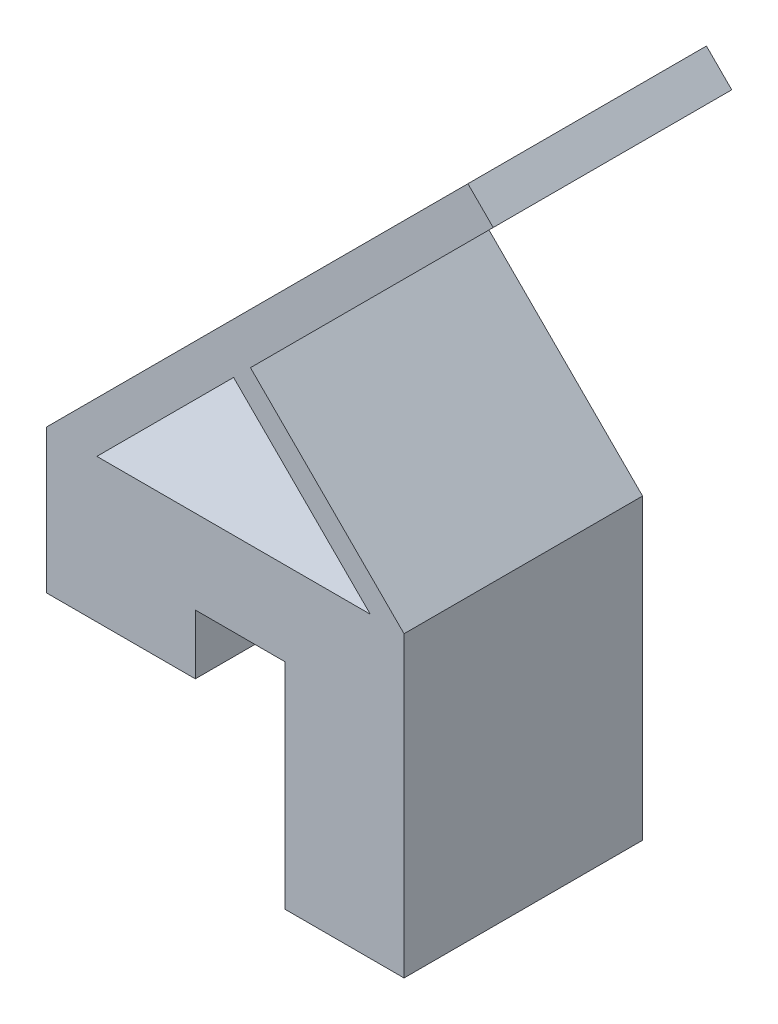
ISO-10303-21;
HEADER;
FILE_DESCRIPTION(('STEP AP214'),'2;1');
FILE_NAME('part.step','',(''),(''),'','','');
FILE_SCHEMA(('AUTOMOTIVE_DESIGN { 1 0 10303 214 1 1 1 1 }'));
ENDSEC;
DATA;
#1=APPLICATION_CONTEXT('core data for automotive mechanical design processes');
#2=APPLICATION_PROTOCOL_DEFINITION('international standard','automotive_design',2000,#1);
#3=PRODUCT_CONTEXT('',#1,'mechanical');
#4=PRODUCT('Part','Part','',(#3));
#5=PRODUCT_RELATED_PRODUCT_CATEGORY('part','',(#4));
#6=PRODUCT_DEFINITION_FORMATION('','',#4);
#7=PRODUCT_DEFINITION_CONTEXT('part definition',#1,'design');
#8=PRODUCT_DEFINITION('design','',#6,#7);
#9=PRODUCT_DEFINITION_SHAPE('','',#8);
#10=(LENGTH_UNIT() NAMED_UNIT(*) SI_UNIT(.MILLI.,.METRE.));
#11=(NAMED_UNIT(*) PLANE_ANGLE_UNIT() SI_UNIT($,.RADIAN.));
#12=(NAMED_UNIT(*) SI_UNIT($,.STERADIAN.) SOLID_ANGLE_UNIT());
#13=UNCERTAINTY_MEASURE_WITH_UNIT(LENGTH_MEASURE(1.E-05),#10,'distance_accuracy_value','');
#14=(GEOMETRIC_REPRESENTATION_CONTEXT(3) GLOBAL_UNCERTAINTY_ASSIGNED_CONTEXT((#13)) GLOBAL_UNIT_ASSIGNED_CONTEXT((#10,
#11,#12)) REPRESENTATION_CONTEXT('',''));
#15=CARTESIAN_POINT('',(0.,0.,0.));
#16=DIRECTION('',(0.,0.,1.));
#17=DIRECTION('',(1.,0.,0.));
#18=AXIS2_PLACEMENT_3D('',#15,#16,#17);
#19=CARTESIAN_POINT('',(0.,3.51351351351352,20.));
#20=DIRECTION('',(0.,-1.,0.));
#21=DIRECTION('',(1.,0.,0.));
#22=AXIS2_PLACEMENT_3D('',#19,#20,#21);
#23=PLANE('',#22);
#24=DIRECTION('',(-1.,0.,0.));
#25=VECTOR('',#24,1.);
#26=CARTESIAN_POINT('',(0.,3.51351351351352,0.));
#27=LINE('',#26,#25);
#28=CARTESIAN_POINT('',(-2.27477477477477,3.51351351351352,0.));
#29=VERTEX_POINT('',#28);
#30=CARTESIAN_POINT('',(-14.7747747747748,3.51351351351351,0.));
#31=VERTEX_POINT('',#30);
#32=EDGE_CURVE('E136',#29,#31,#27,.T.);
#33=ORIENTED_EDGE('',*,*,#32,.F.);
#34=DIRECTION('',(0.,0.,-1.));
#35=VECTOR('',#34,1.);
#36=CARTESIAN_POINT('',(-2.27477477477477,3.51351351351352,20.));
#37=LINE('',#36,#35);
#38=CARTESIAN_POINT('',(-2.27477477477477,3.51351351351352,20.));
#39=VERTEX_POINT('',#38);
#40=EDGE_CURVE('E11',#39,#29,#37,.T.);
#41=ORIENTED_EDGE('',*,*,#40,.F.);
#42=DIRECTION('',(-1.,0.,0.));
#43=VECTOR('',#42,1.);
#44=CARTESIAN_POINT('',(0.,3.51351351351352,20.));
#45=LINE('',#44,#43);
#46=CARTESIAN_POINT('',(-14.7747747747748,3.51351351351351,20.));
#47=VERTEX_POINT('',#46);
#48=EDGE_CURVE('E156',#39,#47,#45,.T.);
#49=ORIENTED_EDGE('',*,*,#48,.T.);
#50=DIRECTION('',(0.,0.,-1.));
#51=VECTOR('',#50,1.);
#52=CARTESIAN_POINT('',(-14.7747747747748,3.51351351351351,20.));
#53=LINE('',#52,#51);
#54=EDGE_CURVE('E86',#47,#31,#53,.T.);
#55=ORIENTED_EDGE('',*,*,#54,.T.);
#56=EDGE_LOOP('',(#33,#41,#49,#55));
#57=FACE_BOUND('',#56,.T.);
#58=ADVANCED_FACE('F33',(#57),#23,.T.);
#59=CARTESIAN_POINT('',(-2.27477477477477,0.,20.));
#60=DIRECTION('',(-1.,0.,0.));
#61=DIRECTION('',(0.,0.,1.));
#62=AXIS2_PLACEMENT_3D('',#59,#60,#61);
#63=PLANE('',#62);
#64=DIRECTION('',(0.,1.,0.));
#65=VECTOR('',#64,1.);
#66=CARTESIAN_POINT('',(-2.27477477477477,0.,0.));
#67=LINE('',#66,#65);
#68=CARTESIAN_POINT('',(-2.27477477477477,8.51351351351352,0.));
#69=VERTEX_POINT('',#68);
#70=EDGE_CURVE('E139',#29,#69,#67,.T.);
#71=ORIENTED_EDGE('',*,*,#70,.T.);
#72=DIRECTION('',(0.,0.,-1.));
#73=VECTOR('',#72,1.);
#74=CARTESIAN_POINT('',(-2.27477477477477,8.51351351351352,20.));
#75=LINE('',#74,#73);
#76=CARTESIAN_POINT('',(-2.27477477477477,8.51351351351352,20.));
#77=VERTEX_POINT('',#76);
#78=EDGE_CURVE('E40',#77,#69,#75,.T.);
#79=ORIENTED_EDGE('',*,*,#78,.F.);
#80=DIRECTION('',(0.,1.,0.));
#81=VECTOR('',#80,1.);
#82=CARTESIAN_POINT('',(-2.27477477477477,0.,20.));
#83=LINE('',#82,#81);
#84=EDGE_CURVE('E267',#39,#77,#83,.T.);
#85=ORIENTED_EDGE('',*,*,#84,.F.);
#86=ORIENTED_EDGE('',*,*,#40,.T.);
#87=EDGE_LOOP('',(#71,#79,#85,#86));
#88=FACE_BOUND('',#87,.T.);
#89=ADVANCED_FACE('F171',(#88),#63,.F.);
#90=CARTESIAN_POINT('',(0.,8.51351351351352,20.));
#91=DIRECTION('',(0.,-1.,0.));
#92=DIRECTION('',(0.,0.,-1.));
#93=AXIS2_PLACEMENT_3D('',#90,#91,#92);
#94=PLANE('',#93);
#95=DIRECTION('',(-1.,0.,0.));
#96=VECTOR('',#95,1.);
#97=CARTESIAN_POINT('',(0.,8.51351351351352,0.));
#98=LINE('',#97,#96);
#99=CARTESIAN_POINT('',(5.22522522522523,8.51351351351352,0.));
#100=VERTEX_POINT('',#99);
#101=EDGE_CURVE('E143',#100,#69,#98,.T.);
#102=ORIENTED_EDGE('',*,*,#101,.F.);
#103=DIRECTION('',(0.,0.,-1.));
#104=VECTOR('',#103,1.);
#105=CARTESIAN_POINT('',(5.22522522522523,8.51351351351352,20.));
#106=LINE('',#105,#104);
#107=CARTESIAN_POINT('',(5.22522522522523,8.51351351351352,20.));
#108=VERTEX_POINT('',#107);
#109=EDGE_CURVE('E122',#108,#100,#106,.T.);
#110=ORIENTED_EDGE('',*,*,#109,.F.);
#111=DIRECTION('',(-1.,0.,0.));
#112=VECTOR('',#111,1.);
#113=CARTESIAN_POINT('',(0.,8.51351351351352,20.));
#114=LINE('',#113,#112);
#115=EDGE_CURVE('E111',#108,#77,#114,.T.);
#116=ORIENTED_EDGE('',*,*,#115,.T.);
#117=ORIENTED_EDGE('',*,*,#78,.T.);
#118=EDGE_LOOP('',(#102,#110,#116,#117));
#119=FACE_BOUND('',#118,.T.);
#120=ADVANCED_FACE('F168',(#119),#94,.T.);
#121=CARTESIAN_POINT('',(5.22522522522523,0.,20.));
#122=DIRECTION('',(1.,0.,0.));
#123=DIRECTION('',(0.,1.,0.));
#124=AXIS2_PLACEMENT_3D('',#121,#122,#123);
#125=PLANE('',#124);
#126=DIRECTION('',(0.,-1.,0.));
#127=VECTOR('',#126,1.);
#128=CARTESIAN_POINT('',(5.22522522522523,0.,0.));
#129=LINE('',#128,#127);
#130=CARTESIAN_POINT('',(5.22522522522523,-9.45945945945945,0.));
#131=VERTEX_POINT('',#130);
#132=EDGE_CURVE('E118',#100,#131,#129,.T.);
#133=ORIENTED_EDGE('',*,*,#132,.T.);
#134=DIRECTION('',(0.,0.,-1.));
#135=VECTOR('',#134,1.);
#136=CARTESIAN_POINT('',(5.22522522522523,-9.45945945945945,20.));
#137=LINE('',#136,#135);
#138=CARTESIAN_POINT('',(5.22522522522523,-9.45945945945945,20.));
#139=VERTEX_POINT('',#138);
#140=EDGE_CURVE('E115',#139,#131,#137,.T.);
#141=ORIENTED_EDGE('',*,*,#140,.F.);
#142=DIRECTION('',(0.,-1.,0.));
#143=VECTOR('',#142,1.);
#144=CARTESIAN_POINT('',(5.22522522522523,0.,20.));
#145=LINE('',#144,#143);
#146=EDGE_CURVE('E103',#108,#139,#145,.T.);
#147=ORIENTED_EDGE('',*,*,#146,.F.);
#148=ORIENTED_EDGE('',*,*,#109,.T.);
#149=EDGE_LOOP('',(#133,#141,#147,#148));
#150=FACE_BOUND('',#149,.T.);
#151=ADVANCED_FACE('F116',(#150),#125,.F.);
#152=CARTESIAN_POINT('',(0.,-9.45945945945945,20.));
#153=DIRECTION('',(0.,1.,0.));
#154=DIRECTION('',(-1.,0.,0.));
#155=AXIS2_PLACEMENT_3D('',#152,#153,#154);
#156=PLANE('',#155);
#157=DIRECTION('',(1.,0.,0.));
#158=VECTOR('',#157,1.);
#159=CARTESIAN_POINT('',(0.,-9.45945945945945,0.));
#160=LINE('',#159,#158);
#161=CARTESIAN_POINT('',(15.2252252252252,-9.45945945945945,0.));
#162=VERTEX_POINT('',#161);
#163=EDGE_CURVE('E147',#131,#162,#160,.T.);
#164=ORIENTED_EDGE('',*,*,#163,.T.);
#165=DIRECTION('',(0.,0.,-1.));
#166=VECTOR('',#165,1.);
#167=CARTESIAN_POINT('',(15.2252252252252,-9.45945945945945,20.));
#168=LINE('',#167,#166);
#169=CARTESIAN_POINT('',(15.2252252252252,-9.45945945945945,20.));
#170=VERTEX_POINT('',#169);
#171=EDGE_CURVE('E123',#170,#162,#168,.T.);
#172=ORIENTED_EDGE('',*,*,#171,.F.);
#173=DIRECTION('',(1.,0.,0.));
#174=VECTOR('',#173,1.);
#175=CARTESIAN_POINT('',(0.,-9.45945945945945,20.));
#176=LINE('',#175,#174);
#177=EDGE_CURVE('E108',#139,#170,#176,.T.);
#178=ORIENTED_EDGE('',*,*,#177,.F.);
#179=ORIENTED_EDGE('',*,*,#140,.T.);
#180=EDGE_LOOP('',(#164,#172,#178,#179));
#181=FACE_BOUND('',#180,.T.);
#182=ADVANCED_FACE('F125',(#181),#156,.F.);
#183=CARTESIAN_POINT('',(15.2252252252252,0.,20.));
#184=DIRECTION('',(1.,0.,0.));
#185=DIRECTION('',(0.,1.,0.));
#186=AXIS2_PLACEMENT_3D('',#183,#184,#185);
#187=PLANE('',#186);
#188=DIRECTION('',(0.,-1.,0.));
#189=VECTOR('',#188,1.);
#190=CARTESIAN_POINT('',(15.2252252252252,0.,0.));
#191=LINE('',#190,#189);
#192=CARTESIAN_POINT('',(15.2252252252252,15.5405405405405,0.));
#193=VERTEX_POINT('',#192);
#194=EDGE_CURVE('E149',#193,#162,#191,.T.);
#195=ORIENTED_EDGE('',*,*,#194,.F.);
#196=DIRECTION('',(0.,0.,-1.));
#197=VECTOR('',#196,1.);
#198=CARTESIAN_POINT('',(15.2252252252252,15.5405405405405,20.));
#199=LINE('',#198,#197);
#200=CARTESIAN_POINT('',(15.2252252252252,15.5405405405405,20.));
#201=VERTEX_POINT('',#200);
#202=EDGE_CURVE('E161',#201,#193,#199,.T.);
#203=ORIENTED_EDGE('',*,*,#202,.F.);
#204=DIRECTION('',(0.,-1.,0.));
#205=VECTOR('',#204,1.);
#206=CARTESIAN_POINT('',(15.2252252252252,0.,20.));
#207=LINE('',#206,#205);
#208=EDGE_CURVE('E127',#201,#170,#207,.T.);
#209=ORIENTED_EDGE('',*,*,#208,.T.);
#210=ORIENTED_EDGE('',*,*,#171,.T.);
#211=EDGE_LOOP('',(#195,#203,#209,#210));
#212=FACE_BOUND('',#211,.T.);
#213=ADVANCED_FACE('F180',(#212),#187,.T.);
#214=CARTESIAN_POINT('',(0.,15.5405405405405,20.));
#215=DIRECTION('',(0.,1.,0.));
#216=DIRECTION('',(-1.,0.,0.));
#217=AXIS2_PLACEMENT_3D('',#214,#215,#216);
#218=PLANE('',#217);
#219=DIRECTION('',(0.,0.,1.));
#220=VECTOR('',#219,1.);
#221=CARTESIAN_POINT('',(12.396798100479,15.5405405405405,0.));
#222=LINE('',#221,#220);
#223=CARTESIAN_POINT('',(12.396798100479,15.5405405405405,0.));
#224=VERTEX_POINT('',#223);
#225=CARTESIAN_POINT('',(12.396798100479,15.5405405405405,20.));
#226=VERTEX_POINT('',#225);
#227=EDGE_CURVE('E237',#224,#226,#222,.T.);
#228=ORIENTED_EDGE('',*,*,#227,.F.);
#229=DIRECTION('',(1.,0.,0.));
#230=VECTOR('',#229,1.);
#231=CARTESIAN_POINT('',(0.,15.5405405405405,0.));
#232=LINE('',#231,#230);
#233=CARTESIAN_POINT('',(-10.5321340876555,15.5405405405406,0.));
#234=VERTEX_POINT('',#233);
#235=EDGE_CURVE('E152',#234,#224,#232,.T.);
#236=ORIENTED_EDGE('',*,*,#235,.F.);
#237=DIRECTION('',(0.,0.,1.));
#238=VECTOR('',#237,1.);
#239=CARTESIAN_POINT('',(-10.5321340876555,15.5405405405405,0.));
#240=LINE('',#239,#238);
#241=CARTESIAN_POINT('',(-10.5321340876555,15.5405405405405,20.));
#242=VERTEX_POINT('',#241);
#243=EDGE_CURVE('E238',#234,#242,#240,.T.);
#244=ORIENTED_EDGE('',*,*,#243,.T.);
#245=DIRECTION('',(1.,0.,0.));
#246=VECTOR('',#245,1.);
#247=CARTESIAN_POINT('',(0.,15.5405405405405,20.));
#248=LINE('',#247,#246);
#249=EDGE_CURVE('E129',#242,#226,#248,.T.);
#250=ORIENTED_EDGE('',*,*,#249,.T.);
#251=EDGE_LOOP('',(#228,#236,#244,#250));
#252=FACE_BOUND('',#251,.T.);
#253=ADVANCED_FACE('F283',(#252),#218,.T.);
#254=CARTESIAN_POINT('',(-14.7747747747748,0.,20.));
#255=DIRECTION('',(1.,0.,0.));
#256=DIRECTION('',(0.,1.,0.));
#257=AXIS2_PLACEMENT_3D('',#254,#255,#256);
#258=PLANE('',#257);
#259=DIRECTION('',(0.,-1.,0.));
#260=VECTOR('',#259,1.);
#261=CARTESIAN_POINT('',(-14.7747747747748,0.,0.));
#262=LINE('',#261,#260);
#263=CARTESIAN_POINT('',(-14.7747747747748,15.5405405405405,0.));
#264=VERTEX_POINT('',#263);
#265=EDGE_CURVE('E154',#264,#31,#262,.T.);
#266=ORIENTED_EDGE('',*,*,#265,.T.);
#267=ORIENTED_EDGE('',*,*,#54,.F.);
#268=DIRECTION('',(0.,-1.,0.));
#269=VECTOR('',#268,1.);
#270=CARTESIAN_POINT('',(-14.7747747747748,0.,20.));
#271=LINE('',#270,#269);
#272=CARTESIAN_POINT('',(-14.7747747747748,15.5405405405405,20.));
#273=VERTEX_POINT('',#272);
#274=EDGE_CURVE('E56',#273,#47,#271,.T.);
#275=ORIENTED_EDGE('',*,*,#274,.F.);
#276=DIRECTION('',(0.,0.,-1.));
#277=VECTOR('',#276,1.);
#278=CARTESIAN_POINT('',(-14.7747747747748,15.5405405405405,20.));
#279=LINE('',#278,#277);
#280=EDGE_CURVE('E158',#273,#264,#279,.T.);
#281=ORIENTED_EDGE('',*,*,#280,.T.);
#282=EDGE_LOOP('',(#266,#267,#275,#281));
#283=FACE_BOUND('',#282,.T.);
#284=ADVANCED_FACE('F286',(#283),#258,.F.);
#285=CARTESIAN_POINT('',(0.,0.,20.));
#286=DIRECTION('',(0.,0.,1.));
#287=DIRECTION('',(1.,0.,0.));
#288=AXIS2_PLACEMENT_3D('',#285,#286,#287);
#289=PLANE('',#288);
#290=ORIENTED_EDGE('',*,*,#249,.F.);
#291=DIRECTION('',(0.707106781186548,0.707106781186547,0.));
#292=VECTOR('',#291,1.);
#293=CARTESIAN_POINT('',(0.932332006411767,27.0050066346078,20.));
#294=LINE('',#293,#292);
#295=CARTESIAN_POINT('',(0.932332006411767,27.0050066346078,20.));
#296=VERTEX_POINT('',#295);
#297=EDGE_CURVE('E235',#242,#296,#294,.T.);
#298=ORIENTED_EDGE('',*,*,#297,.T.);
#299=DIRECTION('',(0.707106781186548,-0.707106781186547,0.));
#300=VECTOR('',#299,1.);
#301=CARTESIAN_POINT('',(0.932332006411767,27.0050066346078,20.));
#302=LINE('',#301,#300);
#303=EDGE_CURVE('E241',#296,#226,#302,.T.);
#304=ORIENTED_EDGE('',*,*,#303,.T.);
#305=EDGE_LOOP('',(#290,#298,#304));
#306=FACE_BOUND('',#305,.T.);
#307=ORIENTED_EDGE('',*,*,#48,.F.);
#308=ORIENTED_EDGE('',*,*,#84,.T.);
#309=ORIENTED_EDGE('',*,*,#115,.F.);
#310=ORIENTED_EDGE('',*,*,#146,.T.);
#311=ORIENTED_EDGE('',*,*,#177,.T.);
#312=ORIENTED_EDGE('',*,*,#208,.F.);
#313=DIRECTION('',(-0.707106781186547,0.707106781186548,0.));
#314=VECTOR('',#313,1.);
#315=CARTESIAN_POINT('',(15.2252252252252,15.5405405405405,20.));
#316=LINE('',#315,#314);
#317=CARTESIAN_POINT('',(2.34654556878486,28.4192201969809,20.));
#318=VERTEX_POINT('',#317);
#319=EDGE_CURVE('E186',#201,#318,#316,.T.);
#320=ORIENTED_EDGE('',*,*,#319,.T.);
#321=DIRECTION('',(0.707106781186548,0.707106781186547,0.));
#322=VECTOR('',#321,1.);
#323=CARTESIAN_POINT('',(22.7018846281122,48.7745592563083,20.));
#324=LINE('',#323,#322);
#325=CARTESIAN_POINT('',(22.7018846281122,48.7745592563083,20.));
#326=VERTEX_POINT('',#325);
#327=EDGE_CURVE('E253',#318,#326,#324,.T.);
#328=ORIENTED_EDGE('',*,*,#327,.T.);
#329=DIRECTION('',(-0.707106781186548,0.707106781186548,0.));
#330=VECTOR('',#329,1.);
#331=CARTESIAN_POINT('',(20.5805642845526,50.8958795998679,20.));
#332=LINE('',#331,#330);
#333=CARTESIAN_POINT('',(20.5805642845526,50.8958795998679,20.));
#334=VERTEX_POINT('',#333);
#335=EDGE_CURVE('E255',#326,#334,#332,.T.);
#336=ORIENTED_EDGE('',*,*,#335,.T.);
#337=DIRECTION('',(-0.707106781186547,-0.707106781186547,0.));
#338=VECTOR('',#337,1.);
#339=CARTESIAN_POINT('',(-14.7747747747748,15.5405405405405,20.));
#340=LINE('',#339,#338);
#341=EDGE_CURVE('E257',#334,#273,#340,.T.);
#342=ORIENTED_EDGE('',*,*,#341,.T.);
#343=ORIENTED_EDGE('',*,*,#274,.T.);
#344=EDGE_LOOP('',(#307,#308,#309,#310,#311,#312,#320,#328,#336,#342,#343));
#345=FACE_BOUND('',#344,.T.);
#346=ADVANCED_FACE('F105',(#306,#345),#289,.T.);
#347=CARTESIAN_POINT('',(0.,0.,0.));
#348=DIRECTION('',(0.,0.,1.));
#349=DIRECTION('',(1.,0.,0.));
#350=AXIS2_PLACEMENT_3D('',#347,#348,#349);
#351=PLANE('',#350);
#352=DIRECTION('',(0.707106781186548,0.707106781186547,0.));
#353=VECTOR('',#352,1.);
#354=CARTESIAN_POINT('',(0.932332006411767,27.0050066346078,0.));
#355=LINE('',#354,#353);
#356=CARTESIAN_POINT('',(0.932332006411767,27.0050066346078,0.));
#357=VERTEX_POINT('',#356);
#358=EDGE_CURVE('E47',#234,#357,#355,.T.);
#359=ORIENTED_EDGE('',*,*,#358,.F.);
#360=ORIENTED_EDGE('',*,*,#235,.T.);
#361=DIRECTION('',(0.707106781186548,-0.707106781186547,0.));
#362=VECTOR('',#361,1.);
#363=CARTESIAN_POINT('',(0.932332006411767,27.0050066346078,0.));
#364=LINE('',#363,#362);
#365=EDGE_CURVE('E322',#357,#224,#364,.T.);
#366=ORIENTED_EDGE('',*,*,#365,.F.);
#367=EDGE_LOOP('',(#359,#360,#366));
#368=FACE_BOUND('',#367,.T.);
#369=ORIENTED_EDGE('',*,*,#32,.T.);
#370=ORIENTED_EDGE('',*,*,#265,.F.);
#371=DIRECTION('',(-0.707106781186547,-0.707106781186547,0.));
#372=VECTOR('',#371,1.);
#373=CARTESIAN_POINT('',(-14.7747747747748,15.5405405405405,0.));
#374=LINE('',#373,#372);
#375=CARTESIAN_POINT('',(20.5805642845526,50.8958795998679,0.));
#376=VERTEX_POINT('',#375);
#377=EDGE_CURVE('E249',#376,#264,#374,.T.);
#378=ORIENTED_EDGE('',*,*,#377,.F.);
#379=DIRECTION('',(-0.707106781186548,0.707106781186548,0.));
#380=VECTOR('',#379,1.);
#381=CARTESIAN_POINT('',(20.5805642845526,50.8958795998679,0.));
#382=LINE('',#381,#380);
#383=CARTESIAN_POINT('',(22.7018846281122,48.7745592563083,0.));
#384=VERTEX_POINT('',#383);
#385=EDGE_CURVE('E316',#384,#376,#382,.T.);
#386=ORIENTED_EDGE('',*,*,#385,.F.);
#387=DIRECTION('',(0.707106781186548,0.707106781186547,0.));
#388=VECTOR('',#387,1.);
#389=CARTESIAN_POINT('',(22.7018846281122,48.7745592563083,0.));
#390=LINE('',#389,#388);
#391=CARTESIAN_POINT('',(2.34654556878486,28.4192201969809,0.));
#392=VERTEX_POINT('',#391);
#393=EDGE_CURVE('E318',#392,#384,#390,.T.);
#394=ORIENTED_EDGE('',*,*,#393,.F.);
#395=DIRECTION('',(-0.707106781186547,0.707106781186548,0.));
#396=VECTOR('',#395,1.);
#397=CARTESIAN_POINT('',(15.2252252252252,15.5405405405405,0.));
#398=LINE('',#397,#396);
#399=EDGE_CURVE('E177',#193,#392,#398,.T.);
#400=ORIENTED_EDGE('',*,*,#399,.F.);
#401=ORIENTED_EDGE('',*,*,#194,.T.);
#402=ORIENTED_EDGE('',*,*,#163,.F.);
#403=ORIENTED_EDGE('',*,*,#132,.F.);
#404=ORIENTED_EDGE('',*,*,#101,.T.);
#405=ORIENTED_EDGE('',*,*,#70,.F.);
#406=EDGE_LOOP('',(#369,#370,#378,#386,#394,#400,#401,#402,#403,#404,#405));
#407=FACE_BOUND('',#406,.T.);
#408=ADVANCED_FACE('F173',(#368,#407),#351,.F.);
#409=CARTESIAN_POINT('',(-14.7747747747748,15.5405405405405,0.));
#410=DIRECTION('',(-0.707106781186548,0.707106781186548,0.));
#411=DIRECTION('',(-0.707106781186548,-0.707106781186548,0.));
#412=AXIS2_PLACEMENT_3D('',#409,#410,#411);
#413=PLANE('',#412);
#414=ORIENTED_EDGE('',*,*,#341,.F.);
#415=DIRECTION('',(0.,0.,1.));
#416=VECTOR('',#415,1.);
#417=CARTESIAN_POINT('',(20.5805642845526,50.8958795998679,0.));
#418=LINE('',#417,#416);
#419=EDGE_CURVE('E140',#376,#334,#418,.T.);
#420=ORIENTED_EDGE('',*,*,#419,.F.);
#421=ORIENTED_EDGE('',*,*,#377,.T.);
#422=ORIENTED_EDGE('',*,*,#280,.F.);
#423=EDGE_LOOP('',(#414,#420,#421,#422));
#424=FACE_BOUND('',#423,.T.);
#425=ADVANCED_FACE('F293',(#424),#413,.T.);
#426=CARTESIAN_POINT('',(20.5805642845526,50.8958795998679,0.));
#427=DIRECTION('',(0.707106781186548,0.707106781186548,0.));
#428=DIRECTION('',(-0.707106781186548,0.707106781186548,0.));
#429=AXIS2_PLACEMENT_3D('',#426,#427,#428);
#430=PLANE('',#429);
#431=ORIENTED_EDGE('',*,*,#335,.F.);
#432=DIRECTION('',(0.,0.,1.));
#433=VECTOR('',#432,1.);
#434=CARTESIAN_POINT('',(22.7018846281122,48.7745592563083,0.));
#435=LINE('',#434,#433);
#436=EDGE_CURVE('E260',#384,#326,#435,.T.);
#437=ORIENTED_EDGE('',*,*,#436,.F.);
#438=ORIENTED_EDGE('',*,*,#385,.T.);
#439=ORIENTED_EDGE('',*,*,#419,.T.);
#440=EDGE_LOOP('',(#431,#437,#438,#439));
#441=FACE_BOUND('',#440,.T.);
#442=ADVANCED_FACE('F306',(#441),#430,.T.);
#443=CARTESIAN_POINT('',(22.7018846281122,48.7745592563083,0.));
#444=DIRECTION('',(0.707106781186547,-0.707106781186548,0.));
#445=DIRECTION('',(0.707106781186548,0.707106781186547,0.));
#446=AXIS2_PLACEMENT_3D('',#443,#444,#445);
#447=PLANE('',#446);
#448=ORIENTED_EDGE('',*,*,#327,.F.);
#449=DIRECTION('',(0.,0.,1.));
#450=VECTOR('',#449,1.);
#451=CARTESIAN_POINT('',(2.34654556878486,28.4192201969809,0.));
#452=LINE('',#451,#450);
#453=EDGE_CURVE('E262',#392,#318,#452,.T.);
#454=ORIENTED_EDGE('',*,*,#453,.F.);
#455=ORIENTED_EDGE('',*,*,#393,.T.);
#456=ORIENTED_EDGE('',*,*,#436,.T.);
#457=EDGE_LOOP('',(#448,#454,#455,#456));
#458=FACE_BOUND('',#457,.T.);
#459=ADVANCED_FACE('F303',(#458),#447,.T.);
#460=CARTESIAN_POINT('',(15.2252252252252,15.5405405405405,0.));
#461=DIRECTION('',(0.707106781186548,0.707106781186547,0.));
#462=DIRECTION('',(-0.707106781186547,0.707106781186548,0.));
#463=AXIS2_PLACEMENT_3D('',#460,#461,#462);
#464=PLANE('',#463);
#465=ORIENTED_EDGE('',*,*,#319,.F.);
#466=ORIENTED_EDGE('',*,*,#202,.T.);
#467=ORIENTED_EDGE('',*,*,#399,.T.);
#468=ORIENTED_EDGE('',*,*,#453,.T.);
#469=EDGE_LOOP('',(#465,#466,#467,#468));
#470=FACE_BOUND('',#469,.T.);
#471=ADVANCED_FACE('F300',(#470),#464,.T.);
#472=CARTESIAN_POINT('',(0.932332006411767,27.0050066346078,0.));
#473=DIRECTION('',(-0.707106781186547,-0.707106781186548,0.));
#474=DIRECTION('',(0.707106781186548,-0.707106781186547,0.));
#475=AXIS2_PLACEMENT_3D('',#472,#473,#474);
#476=PLANE('',#475);
#477=ORIENTED_EDGE('',*,*,#303,.F.);
#478=DIRECTION('',(0.,0.,1.));
#479=VECTOR('',#478,1.);
#480=CARTESIAN_POINT('',(0.932332006411767,27.0050066346078,0.));
#481=LINE('',#480,#479);
#482=EDGE_CURVE('E218',#357,#296,#481,.T.);
#483=ORIENTED_EDGE('',*,*,#482,.F.);
#484=ORIENTED_EDGE('',*,*,#365,.T.);
#485=ORIENTED_EDGE('',*,*,#227,.T.);
#486=EDGE_LOOP('',(#477,#483,#484,#485));
#487=FACE_BOUND('',#486,.T.);
#488=ADVANCED_FACE('F242',(#487),#476,.T.);
#489=CARTESIAN_POINT('',(0.932332006411767,27.0050066346078,0.));
#490=DIRECTION('',(0.707106781186547,-0.707106781186548,0.));
#491=DIRECTION('',(0.707106781186548,0.707106781186547,0.));
#492=AXIS2_PLACEMENT_3D('',#489,#490,#491);
#493=PLANE('',#492);
#494=ORIENTED_EDGE('',*,*,#297,.F.);
#495=ORIENTED_EDGE('',*,*,#243,.F.);
#496=ORIENTED_EDGE('',*,*,#358,.T.);
#497=ORIENTED_EDGE('',*,*,#482,.T.);
#498=EDGE_LOOP('',(#494,#495,#496,#497));
#499=FACE_BOUND('',#498,.T.);
#500=ADVANCED_FACE('F233',(#499),#493,.T.);
#501=CLOSED_SHELL('',(#58,#89,#120,#151,#182,#213,#253,#284,#346,#408,#425,#442,#459,#471,#488,#500));
#502=MANIFOLD_SOLID_BREP('B2',#501);
#503=ADVANCED_BREP_SHAPE_REPRESENTATION('',(#18,#502),#14);
#504=SHAPE_DEFINITION_REPRESENTATION(#9,#503);
ENDSEC;
END-ISO-10303-21;
